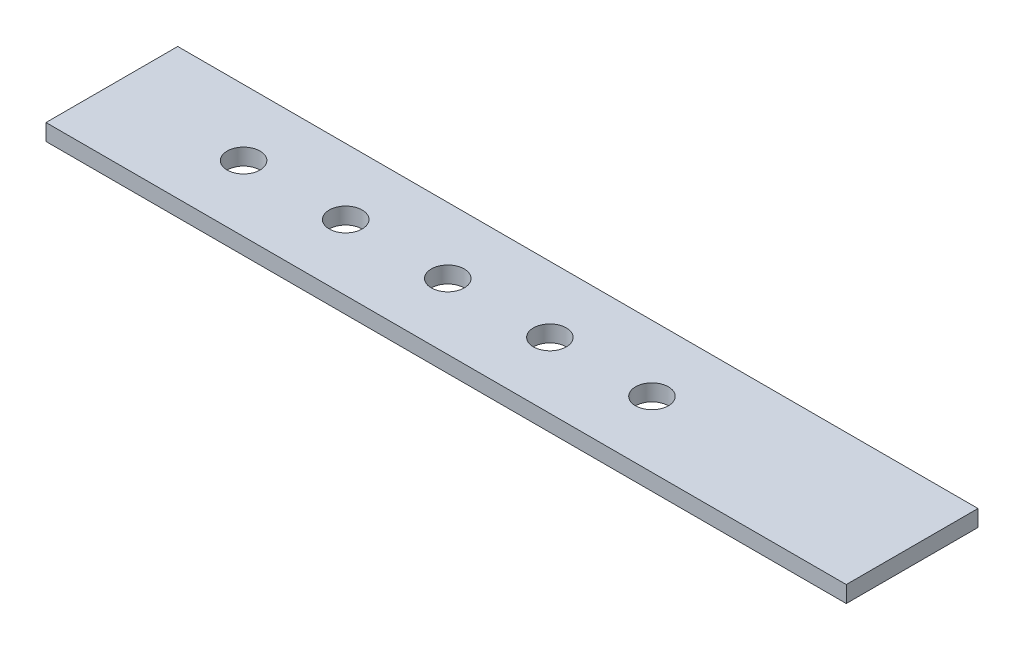
ISO-10303-21;
HEADER;
FILE_DESCRIPTION(('STEP AP214'),'2;1');
FILE_NAME('part.step','',(''),(''),'','','');
FILE_SCHEMA(('AUTOMOTIVE_DESIGN { 1 0 10303 214 1 1 1 1 }'));
ENDSEC;
DATA;
#1=APPLICATION_CONTEXT('core data for automotive mechanical design processes');
#2=APPLICATION_PROTOCOL_DEFINITION('international standard','automotive_design',2000,#1);
#3=PRODUCT_CONTEXT('',#1,'mechanical');
#4=PRODUCT('Part','Part','',(#3));
#5=PRODUCT_RELATED_PRODUCT_CATEGORY('part','',(#4));
#6=PRODUCT_DEFINITION_FORMATION('','',#4);
#7=PRODUCT_DEFINITION_CONTEXT('part definition',#1,'design');
#8=PRODUCT_DEFINITION('design','',#6,#7);
#9=PRODUCT_DEFINITION_SHAPE('','',#8);
#10=(LENGTH_UNIT() NAMED_UNIT(*) SI_UNIT(.MILLI.,.METRE.));
#11=(NAMED_UNIT(*) PLANE_ANGLE_UNIT() SI_UNIT($,.RADIAN.));
#12=(NAMED_UNIT(*) SI_UNIT($,.STERADIAN.) SOLID_ANGLE_UNIT());
#13=UNCERTAINTY_MEASURE_WITH_UNIT(LENGTH_MEASURE(1.E-05),#10,'distance_accuracy_value','');
#14=(GEOMETRIC_REPRESENTATION_CONTEXT(3) GLOBAL_UNCERTAINTY_ASSIGNED_CONTEXT((#13)) GLOBAL_UNIT_ASSIGNED_CONTEXT((#10,
#11,#12)) REPRESENTATION_CONTEXT('',''));
#15=CARTESIAN_POINT('',(0.,0.,0.));
#16=DIRECTION('',(0.,0.,1.));
#17=DIRECTION('',(1.,0.,0.));
#18=AXIS2_PLACEMENT_3D('',#15,#16,#17);
#19=CARTESIAN_POINT('',(0.,3.175,0.));
#20=DIRECTION('',(0.,1.,0.));
#21=DIRECTION('',(0.,0.,1.));
#22=AXIS2_PLACEMENT_3D('',#19,#20,#21);
#23=PLANE('',#22);
#24=CARTESIAN_POINT('',(-128.905,3.175,0.));
#25=DIRECTION('',(0.,1.,0.));
#26=DIRECTION('',(0.,0.,1.));
#27=AXIS2_PLACEMENT_3D('',#24,#25,#26);
#28=CIRCLE('',#27,3.175);
#29=CARTESIAN_POINT('',(-128.905,3.175,3.175));
#30=VERTEX_POINT('',#29);
#31=EDGE_CURVE('E149',#30,#30,#28,.T.);
#32=ORIENTED_EDGE('',*,*,#31,.F.);
#33=EDGE_LOOP('',(#32));
#34=FACE_BOUND('',#33,.T.);
#35=CARTESIAN_POINT('',(-89.535,3.175,0.));
#36=DIRECTION('',(0.,1.,0.));
#37=DIRECTION('',(0.,0.,1.));
#38=AXIS2_PLACEMENT_3D('',#35,#36,#37);
#39=CIRCLE('',#38,3.17500000000001);
#40=CARTESIAN_POINT('',(-89.535,3.175,3.17500000000001));
#41=VERTEX_POINT('',#40);
#42=EDGE_CURVE('E136',#41,#41,#39,.T.);
#43=ORIENTED_EDGE('',*,*,#42,.F.);
#44=EDGE_LOOP('',(#43));
#45=FACE_BOUND('',#44,.T.);
#46=DIRECTION('',(0.,0.,1.));
#47=VECTOR('',#46,1.);
#48=CARTESIAN_POINT('',(-154.305,3.175,-12.7));
#49=LINE('',#48,#47);
#50=CARTESIAN_POINT('',(-154.305,3.175,-12.7));
#51=VERTEX_POINT('',#50);
#52=CARTESIAN_POINT('',(-154.305,3.175,12.7));
#53=VERTEX_POINT('',#52);
#54=EDGE_CURVE('E93',#51,#53,#49,.T.);
#55=ORIENTED_EDGE('',*,*,#54,.T.);
#56=DIRECTION('',(1.,0.,0.));
#57=VECTOR('',#56,1.);
#58=CARTESIAN_POINT('',(-154.305,3.175,12.7));
#59=LINE('',#58,#57);
#60=CARTESIAN_POINT('',(0.,3.175,12.7));
#61=VERTEX_POINT('',#60);
#62=EDGE_CURVE('E88',#53,#61,#59,.T.);
#63=ORIENTED_EDGE('',*,*,#62,.T.);
#64=DIRECTION('',(0.,0.,-1.));
#65=VECTOR('',#64,1.);
#66=CARTESIAN_POINT('',(0.,3.175,-12.7));
#67=LINE('',#66,#65);
#68=CARTESIAN_POINT('',(0.,3.175,-12.7));
#69=VERTEX_POINT('',#68);
#70=EDGE_CURVE('E91',#61,#69,#67,.T.);
#71=ORIENTED_EDGE('',*,*,#70,.T.);
#72=DIRECTION('',(-1.,0.,0.));
#73=VECTOR('',#72,1.);
#74=CARTESIAN_POINT('',(-154.305,3.175,-12.7));
#75=LINE('',#74,#73);
#76=EDGE_CURVE('E58',#69,#51,#75,.T.);
#77=ORIENTED_EDGE('',*,*,#76,.T.);
#78=EDGE_LOOP('',(#55,#63,#71,#77));
#79=FACE_BOUND('',#78,.T.);
#80=CARTESIAN_POINT('',(-109.22,3.175,0.));
#81=DIRECTION('',(0.,1.,0.));
#82=DIRECTION('',(0.,0.,1.));
#83=AXIS2_PLACEMENT_3D('',#80,#81,#82);
#84=CIRCLE('',#83,3.17500000000001);
#85=CARTESIAN_POINT('',(-109.22,3.175,3.17500000000001));
#86=VERTEX_POINT('',#85);
#87=EDGE_CURVE('E115',#86,#86,#84,.T.);
#88=ORIENTED_EDGE('',*,*,#87,.F.);
#89=EDGE_LOOP('',(#88));
#90=FACE_BOUND('',#89,.T.);
#91=CARTESIAN_POINT('',(-69.85,3.175,0.));
#92=DIRECTION('',(0.,1.,0.));
#93=DIRECTION('',(0.,0.,1.));
#94=AXIS2_PLACEMENT_3D('',#91,#92,#93);
#95=CIRCLE('',#94,3.17500000000001);
#96=CARTESIAN_POINT('',(-69.85,3.175,3.17500000000001));
#97=VERTEX_POINT('',#96);
#98=EDGE_CURVE('E143',#97,#97,#95,.T.);
#99=ORIENTED_EDGE('',*,*,#98,.F.);
#100=EDGE_LOOP('',(#99));
#101=FACE_BOUND('',#100,.T.);
#102=CARTESIAN_POINT('',(-50.165,3.175,0.));
#103=DIRECTION('',(0.,1.,0.));
#104=DIRECTION('',(0.,0.,1.));
#105=AXIS2_PLACEMENT_3D('',#102,#103,#104);
#106=CIRCLE('',#105,3.175);
#107=CARTESIAN_POINT('',(-50.165,3.175,3.175));
#108=VERTEX_POINT('',#107);
#109=EDGE_CURVE('E156',#108,#108,#106,.T.);
#110=ORIENTED_EDGE('',*,*,#109,.F.);
#111=EDGE_LOOP('',(#110));
#112=FACE_BOUND('',#111,.T.);
#113=ADVANCED_FACE('F41',(#34,#45,#79,#90,#101,#112),#23,.T.);
#114=CARTESIAN_POINT('',(0.,0.,0.));
#115=DIRECTION('',(0.,1.,0.));
#116=DIRECTION('',(0.,0.,1.));
#117=AXIS2_PLACEMENT_3D('',#114,#115,#116);
#118=PLANE('',#117);
#119=CARTESIAN_POINT('',(-128.905,0.,0.));
#120=DIRECTION('',(0.,1.,0.));
#121=DIRECTION('',(0.,0.,1.));
#122=AXIS2_PLACEMENT_3D('',#119,#120,#121);
#123=CIRCLE('',#122,3.175);
#124=CARTESIAN_POINT('',(-128.905,0.,3.175));
#125=VERTEX_POINT('',#124);
#126=EDGE_CURVE('E153',#125,#125,#123,.T.);
#127=ORIENTED_EDGE('',*,*,#126,.T.);
#128=EDGE_LOOP('',(#127));
#129=FACE_BOUND('',#128,.T.);
#130=CARTESIAN_POINT('',(-89.535,0.,0.));
#131=DIRECTION('',(0.,1.,0.));
#132=DIRECTION('',(0.,0.,1.));
#133=AXIS2_PLACEMENT_3D('',#130,#131,#132);
#134=CIRCLE('',#133,3.17500000000001);
#135=CARTESIAN_POINT('',(-89.535,0.,3.17500000000001));
#136=VERTEX_POINT('',#135);
#137=EDGE_CURVE('E140',#136,#136,#134,.T.);
#138=ORIENTED_EDGE('',*,*,#137,.T.);
#139=EDGE_LOOP('',(#138));
#140=FACE_BOUND('',#139,.T.);
#141=DIRECTION('',(0.,0.,1.));
#142=VECTOR('',#141,1.);
#143=CARTESIAN_POINT('',(-154.305,0.,-12.7));
#144=LINE('',#143,#142);
#145=CARTESIAN_POINT('',(-154.305,0.,-12.7));
#146=VERTEX_POINT('',#145);
#147=CARTESIAN_POINT('',(-154.305,0.,12.7));
#148=VERTEX_POINT('',#147);
#149=EDGE_CURVE('E111',#146,#148,#144,.T.);
#150=ORIENTED_EDGE('',*,*,#149,.F.);
#151=DIRECTION('',(-1.,0.,0.));
#152=VECTOR('',#151,1.);
#153=CARTESIAN_POINT('',(-154.305,0.,-12.7));
#154=LINE('',#153,#152);
#155=CARTESIAN_POINT('',(0.,0.,-12.7));
#156=VERTEX_POINT('',#155);
#157=EDGE_CURVE('E81',#156,#146,#154,.T.);
#158=ORIENTED_EDGE('',*,*,#157,.F.);
#159=DIRECTION('',(0.,0.,-1.));
#160=VECTOR('',#159,1.);
#161=CARTESIAN_POINT('',(0.,0.,-12.7));
#162=LINE('',#161,#160);
#163=CARTESIAN_POINT('',(0.,0.,12.7));
#164=VERTEX_POINT('',#163);
#165=EDGE_CURVE('E75',#164,#156,#162,.T.);
#166=ORIENTED_EDGE('',*,*,#165,.F.);
#167=DIRECTION('',(1.,0.,0.));
#168=VECTOR('',#167,1.);
#169=CARTESIAN_POINT('',(-154.305,0.,12.7));
#170=LINE('',#169,#168);
#171=EDGE_CURVE('E98',#148,#164,#170,.T.);
#172=ORIENTED_EDGE('',*,*,#171,.F.);
#173=EDGE_LOOP('',(#150,#158,#166,#172));
#174=FACE_BOUND('',#173,.T.);
#175=CARTESIAN_POINT('',(-109.22,0.,0.));
#176=DIRECTION('',(0.,1.,0.));
#177=DIRECTION('',(0.,0.,1.));
#178=AXIS2_PLACEMENT_3D('',#175,#176,#177);
#179=CIRCLE('',#178,3.17500000000001);
#180=CARTESIAN_POINT('',(-109.22,0.,3.17500000000001));
#181=VERTEX_POINT('',#180);
#182=EDGE_CURVE('E132',#181,#181,#179,.T.);
#183=ORIENTED_EDGE('',*,*,#182,.T.);
#184=EDGE_LOOP('',(#183));
#185=FACE_BOUND('',#184,.T.);
#186=CARTESIAN_POINT('',(-69.85,0.,0.));
#187=DIRECTION('',(0.,1.,0.));
#188=DIRECTION('',(0.,0.,1.));
#189=AXIS2_PLACEMENT_3D('',#186,#187,#188);
#190=CIRCLE('',#189,3.17500000000001);
#191=CARTESIAN_POINT('',(-69.85,0.,3.17500000000001));
#192=VERTEX_POINT('',#191);
#193=EDGE_CURVE('E146',#192,#192,#190,.T.);
#194=ORIENTED_EDGE('',*,*,#193,.T.);
#195=EDGE_LOOP('',(#194));
#196=FACE_BOUND('',#195,.T.);
#197=CARTESIAN_POINT('',(-50.165,0.,0.));
#198=DIRECTION('',(0.,1.,0.));
#199=DIRECTION('',(0.,0.,1.));
#200=AXIS2_PLACEMENT_3D('',#197,#198,#199);
#201=CIRCLE('',#200,3.175);
#202=CARTESIAN_POINT('',(-50.165,0.,3.175));
#203=VERTEX_POINT('',#202);
#204=EDGE_CURVE('E159',#203,#203,#201,.T.);
#205=ORIENTED_EDGE('',*,*,#204,.T.);
#206=EDGE_LOOP('',(#205));
#207=FACE_BOUND('',#206,.T.);
#208=ADVANCED_FACE('F126',(#129,#140,#174,#185,#196,#207),#118,.F.);
#209=CARTESIAN_POINT('',(-154.305,3.175,-12.7));
#210=DIRECTION('',(1.,0.,0.));
#211=DIRECTION('',(0.,0.,-1.));
#212=AXIS2_PLACEMENT_3D('',#209,#210,#211);
#213=PLANE('',#212);
#214=ORIENTED_EDGE('',*,*,#149,.T.);
#215=DIRECTION('',(0.,-1.,0.));
#216=VECTOR('',#215,1.);
#217=CARTESIAN_POINT('',(-154.305,3.175,12.7));
#218=LINE('',#217,#216);
#219=EDGE_CURVE('E11',#53,#148,#218,.T.);
#220=ORIENTED_EDGE('',*,*,#219,.F.);
#221=ORIENTED_EDGE('',*,*,#54,.F.);
#222=DIRECTION('',(0.,-1.,0.));
#223=VECTOR('',#222,1.);
#224=CARTESIAN_POINT('',(-154.305,3.175,-12.7));
#225=LINE('',#224,#223);
#226=EDGE_CURVE('E107',#51,#146,#225,.T.);
#227=ORIENTED_EDGE('',*,*,#226,.T.);
#228=EDGE_LOOP('',(#214,#220,#221,#227));
#229=FACE_BOUND('',#228,.T.);
#230=ADVANCED_FACE('F43',(#229),#213,.F.);
#231=CARTESIAN_POINT('',(-154.305,3.175,12.7));
#232=DIRECTION('',(0.,0.,-1.));
#233=DIRECTION('',(-1.,0.,0.));
#234=AXIS2_PLACEMENT_3D('',#231,#232,#233);
#235=PLANE('',#234);
#236=ORIENTED_EDGE('',*,*,#171,.T.);
#237=DIRECTION('',(0.,-1.,0.));
#238=VECTOR('',#237,1.);
#239=CARTESIAN_POINT('',(0.,3.175,12.7));
#240=LINE('',#239,#238);
#241=EDGE_CURVE('E50',#61,#164,#240,.T.);
#242=ORIENTED_EDGE('',*,*,#241,.F.);
#243=ORIENTED_EDGE('',*,*,#62,.F.);
#244=ORIENTED_EDGE('',*,*,#219,.T.);
#245=EDGE_LOOP('',(#236,#242,#243,#244));
#246=FACE_BOUND('',#245,.T.);
#247=ADVANCED_FACE('F97',(#246),#235,.F.);
#248=CARTESIAN_POINT('',(0.,3.175,-12.7));
#249=DIRECTION('',(-1.,0.,0.));
#250=DIRECTION('',(0.,0.,1.));
#251=AXIS2_PLACEMENT_3D('',#248,#249,#250);
#252=PLANE('',#251);
#253=ORIENTED_EDGE('',*,*,#165,.T.);
#254=DIRECTION('',(0.,-1.,0.));
#255=VECTOR('',#254,1.);
#256=CARTESIAN_POINT('',(0.,3.175,-12.7));
#257=LINE('',#256,#255);
#258=EDGE_CURVE('E99',#69,#156,#257,.T.);
#259=ORIENTED_EDGE('',*,*,#258,.F.);
#260=ORIENTED_EDGE('',*,*,#70,.F.);
#261=ORIENTED_EDGE('',*,*,#241,.T.);
#262=EDGE_LOOP('',(#253,#259,#260,#261));
#263=FACE_BOUND('',#262,.T.);
#264=ADVANCED_FACE('F100',(#263),#252,.F.);
#265=CARTESIAN_POINT('',(-154.305,3.175,-12.7));
#266=DIRECTION('',(0.,0.,1.));
#267=DIRECTION('',(1.,0.,0.));
#268=AXIS2_PLACEMENT_3D('',#265,#266,#267);
#269=PLANE('',#268);
#270=ORIENTED_EDGE('',*,*,#157,.T.);
#271=ORIENTED_EDGE('',*,*,#226,.F.);
#272=ORIENTED_EDGE('',*,*,#76,.F.);
#273=ORIENTED_EDGE('',*,*,#258,.T.);
#274=EDGE_LOOP('',(#270,#271,#272,#273));
#275=FACE_BOUND('',#274,.T.);
#276=ADVANCED_FACE('F123',(#275),#269,.F.);
#277=CARTESIAN_POINT('',(-109.22,3.175,0.));
#278=DIRECTION('',(0.,-1.,0.));
#279=DIRECTION('',(0.,0.,-1.));
#280=AXIS2_PLACEMENT_3D('',#277,#278,#279);
#281=CYLINDRICAL_SURFACE('',#280,3.17500000000001);
#282=ORIENTED_EDGE('',*,*,#87,.T.);
#283=EDGE_LOOP('',(#282));
#284=FACE_BOUND('',#283,.T.);
#285=ORIENTED_EDGE('',*,*,#182,.F.);
#286=EDGE_LOOP('',(#285));
#287=FACE_BOUND('',#286,.T.);
#288=ADVANCED_FACE('F182',(#284,#287),#281,.F.);
#289=CARTESIAN_POINT('',(-89.535,3.175,0.));
#290=DIRECTION('',(0.,-1.,0.));
#291=DIRECTION('',(0.,0.,-1.));
#292=AXIS2_PLACEMENT_3D('',#289,#290,#291);
#293=CYLINDRICAL_SURFACE('',#292,3.17500000000001);
#294=ORIENTED_EDGE('',*,*,#42,.T.);
#295=EDGE_LOOP('',(#294));
#296=FACE_BOUND('',#295,.T.);
#297=ORIENTED_EDGE('',*,*,#137,.F.);
#298=EDGE_LOOP('',(#297));
#299=FACE_BOUND('',#298,.T.);
#300=ADVANCED_FACE('F215',(#296,#299),#293,.F.);
#301=CARTESIAN_POINT('',(-69.85,3.175,0.));
#302=DIRECTION('',(0.,-1.,0.));
#303=DIRECTION('',(0.,0.,-1.));
#304=AXIS2_PLACEMENT_3D('',#301,#302,#303);
#305=CYLINDRICAL_SURFACE('',#304,3.17500000000001);
#306=ORIENTED_EDGE('',*,*,#98,.T.);
#307=EDGE_LOOP('',(#306));
#308=FACE_BOUND('',#307,.T.);
#309=ORIENTED_EDGE('',*,*,#193,.F.);
#310=EDGE_LOOP('',(#309));
#311=FACE_BOUND('',#310,.T.);
#312=ADVANCED_FACE('F210',(#308,#311),#305,.F.);
#313=CARTESIAN_POINT('',(-128.905,3.175,0.));
#314=DIRECTION('',(0.,-1.,0.));
#315=DIRECTION('',(0.,0.,-1.));
#316=AXIS2_PLACEMENT_3D('',#313,#314,#315);
#317=CYLINDRICAL_SURFACE('',#316,3.175);
#318=ORIENTED_EDGE('',*,*,#31,.T.);
#319=EDGE_LOOP('',(#318));
#320=FACE_BOUND('',#319,.T.);
#321=ORIENTED_EDGE('',*,*,#126,.F.);
#322=EDGE_LOOP('',(#321));
#323=FACE_BOUND('',#322,.T.);
#324=ADVANCED_FACE('F214',(#320,#323),#317,.F.);
#325=CARTESIAN_POINT('',(-50.165,3.175,0.));
#326=DIRECTION('',(0.,-1.,0.));
#327=DIRECTION('',(0.,0.,-1.));
#328=AXIS2_PLACEMENT_3D('',#325,#326,#327);
#329=CYLINDRICAL_SURFACE('',#328,3.175);
#330=ORIENTED_EDGE('',*,*,#109,.T.);
#331=EDGE_LOOP('',(#330));
#332=FACE_BOUND('',#331,.T.);
#333=ORIENTED_EDGE('',*,*,#204,.F.);
#334=EDGE_LOOP('',(#333));
#335=FACE_BOUND('',#334,.T.);
#336=ADVANCED_FACE('F168',(#332,#335),#329,.F.);
#337=CLOSED_SHELL('',(#113,#208,#230,#247,#264,#276,#288,#300,#312,#324,#336));
#338=MANIFOLD_SOLID_BREP('B2',#337);
#339=ADVANCED_BREP_SHAPE_REPRESENTATION('',(#18,#338),#14);
#340=SHAPE_DEFINITION_REPRESENTATION(#9,#339);
ENDSEC;
END-ISO-10303-21;
